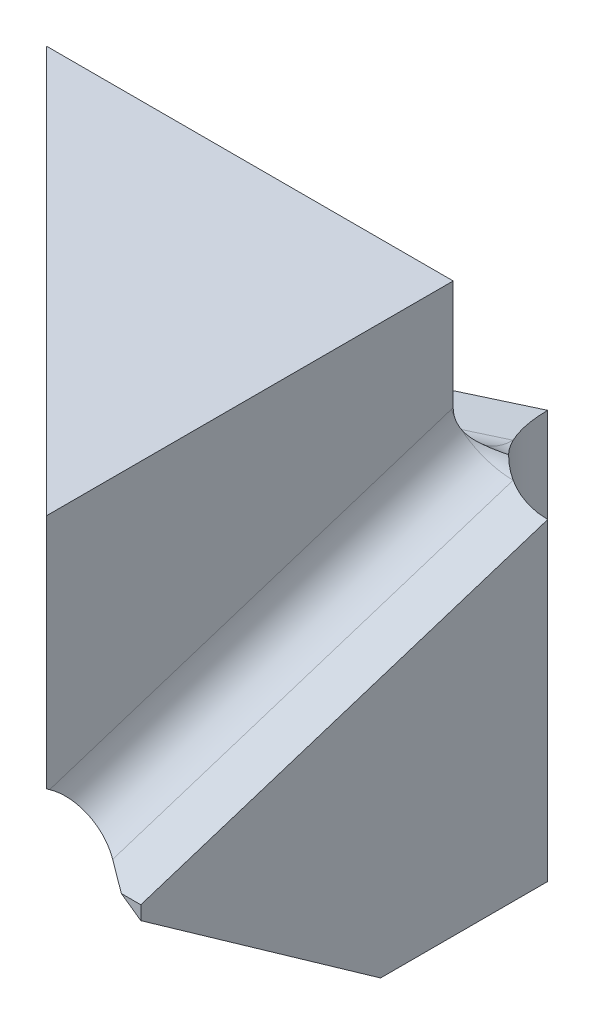
ISO-10303-21;
HEADER;
FILE_DESCRIPTION(('STEP AP214'),'2;1');
FILE_NAME('part.step','',(''),(''),'','','');
FILE_SCHEMA(('AUTOMOTIVE_DESIGN { 1 0 10303 214 1 1 1 1 }'));
ENDSEC;
DATA;
#1=APPLICATION_CONTEXT('core data for automotive mechanical design processes');
#2=APPLICATION_PROTOCOL_DEFINITION('international standard','automotive_design',2000,#1);
#3=PRODUCT_CONTEXT('',#1,'mechanical');
#4=PRODUCT('Part','Part','',(#3));
#5=PRODUCT_RELATED_PRODUCT_CATEGORY('part','',(#4));
#6=PRODUCT_DEFINITION_FORMATION('','',#4);
#7=PRODUCT_DEFINITION_CONTEXT('part definition',#1,'design');
#8=PRODUCT_DEFINITION('design','',#6,#7);
#9=PRODUCT_DEFINITION_SHAPE('','',#8);
#10=(LENGTH_UNIT() NAMED_UNIT(*) SI_UNIT(.MILLI.,.METRE.));
#11=(NAMED_UNIT(*) PLANE_ANGLE_UNIT() SI_UNIT($,.RADIAN.));
#12=(NAMED_UNIT(*) SI_UNIT($,.STERADIAN.) SOLID_ANGLE_UNIT());
#13=UNCERTAINTY_MEASURE_WITH_UNIT(LENGTH_MEASURE(1.E-05),#10,'distance_accuracy_value','');
#14=(GEOMETRIC_REPRESENTATION_CONTEXT(3) GLOBAL_UNCERTAINTY_ASSIGNED_CONTEXT((#13)) GLOBAL_UNIT_ASSIGNED_CONTEXT((#10,
#11,#12)) REPRESENTATION_CONTEXT('',''));
#15=CARTESIAN_POINT('',(0.,0.,0.));
#16=DIRECTION('',(0.,0.,1.));
#17=DIRECTION('',(1.,0.,0.));
#18=AXIS2_PLACEMENT_3D('',#15,#16,#17);
#19=CARTESIAN_POINT('',(-3.9587847280009,14.3567470669046,0.572733338777171));
#20=CARTESIAN_POINT('',(-4.,14.5390634799835,0.490840757525004));
#21=CARTESIAN_POINT('',(-4.,14.7252160576227,0.407225054296887));
#22=CARTESIAN_POINT('',(-3.94284944477179,14.3213982166722,0.683229532097432));
#23=CARTESIAN_POINT('',(-4.,14.5381938317096,0.586646422680381));
#24=CARTESIAN_POINT('',(-4.,14.7610316114819,0.486966757060718));
#25=CARTESIAN_POINT('',(-3.92228213629969,14.2864673353374,0.792419205635512));
#26=CARTESIAN_POINT('',(-4.,14.5366740066187,0.68208169559585));
#27=CARTESIAN_POINT('',(-4.,14.796520148253,0.566862144557146));
#28=CARTESIAN_POINT('',(-3.8727337027747,14.2178368997367,1.00694957451438));
#29=CARTESIAN_POINT('',(-4.,14.5317036798462,0.871853574955629));
#30=CARTESIAN_POINT('',(-4.,14.8664313247328,0.727144062725661));
#31=CARTESIAN_POINT('',(-3.84375016889392,14.1841377011069,1.11228915818009));
#32=CARTESIAN_POINT('',(-4.,14.5282347149522,0.966394602848275));
#33=CARTESIAN_POINT('',(-4.,14.9008536561546,0.807530727550029));
#34=CARTESIAN_POINT('',(-3.77805637034273,14.1182128690961,1.31836214031652));
#35=CARTESIAN_POINT('',(-4.,14.5186406293924,1.15440659142866));
#36=CARTESIAN_POINT('',(-4.,14.9683776412554,0.969360276642717));
#37=CARTESIAN_POINT('',(-3.74130605161888,14.0859959716296,1.41906823138416));
#38=CARTESIAN_POINT('',(-4.,14.5124684110823,1.24805165668356));
#39=CARTESIAN_POINT('',(-4.,15.0014713473771,1.05080649850616));
#40=CARTESIAN_POINT('',(-3.66134226974637,14.0235670379073,1.61421346196489));
#41=CARTESIAN_POINT('',(-4.,14.4968213692411,1.43321486030638));
#42=CARTESIAN_POINT('',(-4.,15.0656805276228,1.21447113533519));
#43=CARTESIAN_POINT('',(-3.61812933815874,13.9933548370566,1.70865311598176));
#44=CARTESIAN_POINT('',(-4.,14.4872955194984,1.52489007097519));
#45=CARTESIAN_POINT('',(-4.,15.0967961641468,1.29668948627105));
#46=CARTESIAN_POINT('',(-3.52510520879411,13.9342780126004,1.89332006194871));
#47=CARTESIAN_POINT('',(-4.,14.4639890996214,1.70836697505896));
#48=CARTESIAN_POINT('',(-4.,15.1575059033337,1.46463355037762));
#49=CARTESIAN_POINT('',(-3.47512875178548,13.9054860609305,1.9833201902945));
#50=CARTESIAN_POINT('',(-4.,14.4500126373161,1.8001713297107));
#51=CARTESIAN_POINT('',(-4.,15.1870209405877,1.55038803778439));
#52=CARTESIAN_POINT('',(-3.37124680385852,13.85050799515,2.15517491668371));
#53=CARTESIAN_POINT('',(-4.,14.4173962200826,1.97999170960518));
#54=CARTESIAN_POINT('',(-4.,15.2428498103331,1.72293100802866));
#55=CARTESIAN_POINT('',(-3.31734169821602,13.8243216261086,2.23703031161001));
#56=CARTESIAN_POINT('',(-4.,14.398660022636,2.06808664934039));
#57=CARTESIAN_POINT('',(-4.,15.2691639560568,1.80971938877758));
#58=CARTESIAN_POINT('',(-3.20726601880701,13.7746909172748,2.39216985255332));
#59=CARTESIAN_POINT('',(-4.,14.3561928720235,2.23935533800004));
#60=CARTESIAN_POINT('',(-4.,15.3179334849664,1.98419367495977));
#61=CARTESIAN_POINT('',(-3.15110023998523,13.7512411467669,2.46547097432481));
#62=CARTESIAN_POINT('',(-4.,14.332360285231,2.32256104049252));
#63=CARTESIAN_POINT('',(-4.,15.3403965535836,2.07187741389278));
#64=CARTESIAN_POINT('',(-3.03788042766943,13.7070195278565,2.6037023600683));
#65=CARTESIAN_POINT('',(-4.,14.2795145426535,2.48315219639589));
#66=CARTESIAN_POINT('',(-4.,15.380883935097,2.24825297812546));
#67=CARTESIAN_POINT('',(-2.98082660375943,13.6862470580211,2.668634566564));
#68=CARTESIAN_POINT('',(-4.,14.2503844128841,2.56049641252093));
#69=CARTESIAN_POINT('',(-4.,15.3989092789286,2.33694456427227));
#70=CARTESIAN_POINT('',(-2.86757279163667,13.6474346961127,2.78995727484036));
#71=CARTESIAN_POINT('',(-4.,14.1872794873121,2.70763752838669));
#72=CARTESIAN_POINT('',(-4.,15.4297433144023,2.51452387796022));
#73=CARTESIAN_POINT('',(-2.81136961682769,13.6293746211112,2.84641086599335));
#74=CARTESIAN_POINT('',(-4.,14.1532269926845,2.77739672363416));
#75=CARTESIAN_POINT('',(-4.,15.4425918711017,2.60340459230831));
#76=CARTESIAN_POINT('',(-2.70043004398257,13.5956370805876,2.95187030174123));
#77=CARTESIAN_POINT('',(-4.,14.0804727074215,2.90891644531297));
#78=CARTESIAN_POINT('',(-4.,15.4626176552203,2.78183207720505));
#79=CARTESIAN_POINT('',(-2.64569390750886,13.579960037646,3.00087482540135));
#80=CARTESIAN_POINT('',(-4.,14.0416720275391,2.97051576312377));
#81=CARTESIAN_POINT('',(-4.,15.4697938777163,2.87137896293887));
#82=CARTESIAN_POINT('',(-2.53919133773913,13.5509698431891,3.09149463651408));
#83=CARTESIAN_POINT('',(-4.,13.9606290246087,3.08387386658353));
#84=CARTESIAN_POINT('',(-4.,15.477771647049,3.04970102660568));
#85=CARTESIAN_POINT('',(-2.48739729521727,13.5376307563738,3.13319099455021));
#86=CARTESIAN_POINT('',(-4.,13.9183530606901,3.1355531970364));
#87=CARTESIAN_POINT('',(-4.,15.4786481142717,3.13847269002629));
#88=CARTESIAN_POINT('',(-2.38669442872466,13.5128782876611,3.21056419198254));
#89=CARTESIAN_POINT('',(-4.,13.8309728338749,3.2289944925258));
#90=CARTESIAN_POINT('',(-4.,15.4736220860094,3.31584260569087));
#91=CARTESIAN_POINT('',(-2.3377857255209,13.501464986331,3.246240779535));
#92=CARTESIAN_POINT('',(-4.,13.7858330402097,3.27052089669927));
#93=CARTESIAN_POINT('',(-4.,15.4677193069879,3.40444085052648));
#94=CARTESIAN_POINT('',(-2.24294701803069,13.4802726958408,3.31248529417998));
#95=CARTESIAN_POINT('',(-4.,13.693756163331,3.34311435610799));
#96=CARTESIAN_POINT('',(-4.,15.448514571647,3.58147300235636));
#97=CARTESIAN_POINT('',(-2.19704009508902,13.4705056247599,3.34301596681098));
#98=CARTESIAN_POINT('',(-4.,13.6468221686857,3.37384157580455));
#99=CARTESIAN_POINT('',(-4.,15.435161442217,3.66990148120799));
#100=CARTESIAN_POINT('',(-2.1088577643969,13.4524898519951,3.399331074577));
#101=CARTESIAN_POINT('',(-4.,13.5531797552249,3.42391410192285));
#102=CARTESIAN_POINT('',(-4.,15.4005461679276,3.84517465921719));
#103=CARTESIAN_POINT('',(-2.06658089153818,13.4442405361858,3.42511742939277));
#104=CARTESIAN_POINT('',(-4.,13.5065251942167,3.44299998186926));
#105=CARTESIAN_POINT('',(-4.,15.37928723254,3.93201998608967));
#106=CARTESIAN_POINT('',(-1.98489663581398,13.428887467458,3.47310924918496));
#107=CARTESIAN_POINT('',(-4.,13.4143895525466,3.46996967643741));
#108=CARTESIAN_POINT('',(-4.,15.327928014759,4.10512169171207));
#109=CARTESIAN_POINT('',(-1.94557056301251,13.4218121809257,3.49522573171049));
#110=CARTESIAN_POINT('',(-4.,13.3690833483177,3.47733316597455));
#111=CARTESIAN_POINT('',(-4.,15.2976473459936,4.19132519598123));
#112=CARTESIAN_POINT('',(-1.87075795898145,13.4088249269558,3.53582230319515));
#113=CARTESIAN_POINT('',(-4.,13.2828681584571,3.48056771974962));
#114=CARTESIAN_POINT('',(-4.,15.2281633045946,4.36023505535053));
#115=CARTESIAN_POINT('',(-1.83527876041303,13.4029151642024,3.55429550058021));
#116=CARTESIAN_POINT('',(-4.,13.2421240526581,3.47618410455557));
#117=CARTESIAN_POINT('',(-4.,15.1889433188087,4.44293455477388));
#118=CARTESIAN_POINT('',(-1.80176573367737,13.3974995936029,3.57122391358286));
#119=CARTESIAN_POINT('',(-4.,13.2052163299937,3.46648128327573));
#120=CARTESIAN_POINT('',(-4.,15.1451762287153,4.52323733509426));
#121=(BOUNDED_SURFACE() B_SPLINE_SURFACE(3,2,((#19,#20,#21),(#22,#23,#24),(#25,#26,#27),(#28,
#29,#30),(#31,#32,#33),(#34,#35,#36),(#37,#38,#39),(#40,#41,#42),(#43,#44,#45),(#46,#47,#48),
(#49,#50,#51),(#52,#53,#54),(#55,#56,#57),(#58,#59,#60),(#61,#62,#63),(#64,#65,#66),(#67,#68,
#69),(#70,#71,#72),(#73,#74,#75),(#76,#77,#78),(#79,#80,#81),(#82,#83,#84),(#85,#86,#87),(#88,
#89,#90),(#91,#92,#93),(#94,#95,#96),(#97,#98,#99),(#100,#101,#102),(#103,#104,#105),(#106,#107,
#108),(#109,#110,#111),(#112,#113,#114),(#115,#116,#117),(#118,#119,#120)),.UNSPECIFIED.,.F.,
.F.,.F.) B_SPLINE_SURFACE_WITH_KNOTS((4,2,2,2,2,2,2,2,2,2,2,2,2,2,2,2,4),(3,3),(0.,
0.262255722437478,0.524586579817895,0.788304839549322,1.05200141991811,1.3240243174193,
1.59602057390377,1.8674675354427,2.13885137704375,2.40810347455745,2.67740326268259,
2.94349499871625,3.20959786423251,3.47755137923927,3.74539623332907,4.01900395364131,
4.29312436348683),(0.,1.),
.UNSPECIFIED.) GEOMETRIC_REPRESENTATION_ITEM() RATIONAL_B_SPLINE_SURFACE(((1.,0.994834751101963,
1.),(1.,0.992831026008785,1.),(1.,0.990242198756409,1.),(1.,0.983968509338628,1.),(1.,
0.980283333377233,1.),(1.,0.97187016110895,1.),(1.,0.967136752663451,1.),(1.,0.956745821892291,
1.),(1.,0.95108837556681,1.),(1.,0.938783923009572,1.),(1.,0.932111311554105,1.),(1.,
0.918074565008446,1.),(1.,0.910710497707777,1.),(1.,0.895474392815812,1.),(1.,0.88760341110103,
1.),(1.,0.871512939183269,1.),(1.,0.863293530445041,1.),(1.,0.846735621862672,1.),(1.,
0.838398564647075,1.),(1.,0.821691743261551,1.),(1.,0.813321973560039,1.),(1.,0.796784430057094,
1.),(1.,0.788615437713728,1.),(1.,0.772488614543376,1.),(1.,0.764530792562669,1.),(1.,
0.748864851389619,1.),(1.,0.741158853686201,1.),(1.,0.726134208290024,1.),(1.,0.718815404785734,
1.),(1.,0.70446910192755,1.),(1.,0.697451258238533,1.),(1.,0.683911931378461,1.),(1.,
0.677391402934751,1.),(1.,0.671149337643525,1.))) REPRESENTATION_ITEM('') SURFACE());
#122=CARTESIAN_POINT('',(-0.407225054296884,14.7252160576226,4.));
#123=CARTESIAN_POINT('',(-0.490840804336252,14.5390634644715,4.));
#124=CARTESIAN_POINT('',(-0.572733430877928,14.3567470374406,3.95878471467631));
#125=CARTESIAN_POINT('',(-0.486966757070065,14.7610316114921,4.));
#126=CARTESIAN_POINT('',(-0.586646439602195,14.538193826124,4.));
#127=CARTESIAN_POINT('',(-0.683229565204288,14.321398206081,3.94284943997505));
#128=CARTESIAN_POINT('',(-0.56686214457917,14.7965201482654,4.));
#129=CARTESIAN_POINT('',(-0.682081700183671,14.5366740051162,4.));
#130=CARTESIAN_POINT('',(-0.792419214539417,14.286467332489,3.92228213500659));
#131=CARTESIAN_POINT('',(-0.727144062775511,14.8664313247477,4.));
#132=CARTESIAN_POINT('',(-0.871853570395886,14.5317036813537,4.));
#133=CARTESIAN_POINT('',(-1.00694956571245,14.2178369025525,3.87273370404404));
#134=CARTESIAN_POINT('',(-0.807530727615038,14.9008536561698,4.));
#135=CARTESIAN_POINT('',(-0.966394601677082,14.5282347153531,4.));
#136=CARTESIAN_POINT('',(-1.11228915588401,14.1841377018414,3.84375016922061));
#137=CARTESIAN_POINT('',(-0.969360276736809,14.9683776412835,4.));
#138=CARTESIAN_POINT('',(-1.15440659282498,14.5186406289589,4.));
#139=CARTESIAN_POINT('',(-1.31836214285246,14.1182128682848,3.77805636994171));
#140=CARTESIAN_POINT('',(-1.05080649861418,15.0014713474178,4.));
#141=CARTESIAN_POINT('',(-1.24805165717336,14.5124684109407,4.));
#142=CARTESIAN_POINT('',(-1.41906823220261,14.0859959713678,3.74130605143864));
#143=CARTESIAN_POINT('',(-1.21447113547482,15.0656805276793,4.));
#144=CARTESIAN_POINT('',(-1.43321486009169,14.49682136936,4.));
#145=CARTESIAN_POINT('',(-1.61421346144477,14.0235670380737,3.66134226980438));
#146=CARTESIAN_POINT('',(-1.29668948642835,15.0967961642063,4.));
#147=CARTESIAN_POINT('',(-1.52489007097835,14.4872955195826,4.));
#148=CARTESIAN_POINT('',(-1.70865311584038,13.9933548371018,3.61812933823422));
#149=CARTESIAN_POINT('',(-1.46463355053873,15.1575059033891,4.));
#150=CARTESIAN_POINT('',(-1.70836697541343,14.4639890994888,4.));
#151=CARTESIAN_POINT('',(-1.89332006244599,13.9342780124414,3.5251052085392));
#152=CARTESIAN_POINT('',(-1.55038803793125,15.1870209406368,4.));
#153=CARTESIAN_POINT('',(-1.80017133020941,14.4500126369944,4.));
#154=CARTESIAN_POINT('',(-1.98332019105145,13.9054860606884,3.47512875117263));
#155=CARTESIAN_POINT('',(-1.72293100814693,15.2428498103698,4.));
#156=CARTESIAN_POINT('',(-1.97999170936587,14.4173962203595,4.));
#157=CARTESIAN_POINT('',(-2.15517491619675,13.8505079953058,3.37124680430815));
#158=CARTESIAN_POINT('',(-1.8097193888815,15.2691639560873,4.));
#159=CARTESIAN_POINT('',(-2.06808664815174,14.3986600237262,4.));
#160=CARTESIAN_POINT('',(-2.23703030961963,13.8243216267453,3.31734170008592));
#161=CARTESIAN_POINT('',(-1.98419367503462,15.3179334849859,4.));
#162=CARTESIAN_POINT('',(-2.23935533942236,14.3561928708684,4.));
#163=CARTESIAN_POINT('',(-2.39216985467702,13.7746909165954,3.20726601684344));
#164=CARTESIAN_POINT('',(-2.0718774139529,15.3403965535982,4.));
#165=CARTESIAN_POINT('',(-2.32256104572954,14.3323602809078,4.));
#166=CARTESIAN_POINT('',(-2.46547098205161,13.751241144295,3.15110023278141));
#167=CARTESIAN_POINT('',(-2.24825297815577,15.3808839351032,4.));
#168=CARTESIAN_POINT('',(-2.48315219095676,14.2795145470894,4.));
#169=CARTESIAN_POINT('',(-2.60370235241894,13.7070195303036,3.03788043480962));
#170=CARTESIAN_POINT('',(-2.33694456428751,15.3989092789312,4.));
#171=CARTESIAN_POINT('',(-2.56049639158915,14.2503844297637,4.));
#172=CARTESIAN_POINT('',(-2.66863453794155,13.6862470671777,2.9808266304781));
#173=CARTESIAN_POINT('',(-2.51452387795965,15.4297433144023,4.));
#174=CARTESIAN_POINT('',(-2.70763750650069,14.1872795047018,4.));
#175=CARTESIAN_POINT('',(-2.78995724639888,13.6474347052114,2.86757281818723));
#176=CARTESIAN_POINT('',(-2.60340459230715,15.4425918711018,4.));
#177=CARTESIAN_POINT('',(-2.77739671762668,14.153226997431,4.));
#178=CARTESIAN_POINT('',(-2.8464108583751,13.6293746235483,2.81136962393933));
#179=CARTESIAN_POINT('',(-2.78183207720282,15.4626176552197,4.));
#180=CARTESIAN_POINT('',(-2.90891645160853,14.080472702486,4.));
#181=CARTESIAN_POINT('',(-2.95187030936,13.5956370781503,2.70043003687055));
#182=CARTESIAN_POINT('',(-2.87137896293615,15.4697938777148,4.));
#183=CARTESIAN_POINT('',(-2.97051576483739,14.0416720261984,4.));
#184=CARTESIAN_POINT('',(-3.00087482742925,13.5799600369972,2.64569390561647));
#185=CARTESIAN_POINT('',(-3.04970102660299,15.4777716470477,4.));
#186=CARTESIAN_POINT('',(-3.08387386481225,13.96062902599,4.));
#187=CARTESIAN_POINT('',(-3.09149463450686,13.5509698438312,2.53919133961307));
#188=CARTESIAN_POINT('',(-3.13847269002414,15.4786481142714,4.));
#189=CARTESIAN_POINT('',(-3.13555319655319,13.9183530610657,4.));
#190=CARTESIAN_POINT('',(-3.13319099401434,13.5376307565452,2.48739729571666));
#191=CARTESIAN_POINT('',(-3.31584260568979,15.4736220860098,4.));
#192=CARTESIAN_POINT('',(-3.22899449302988,13.8309728334797,4.));
#193=CARTESIAN_POINT('',(-3.21056419252153,13.5128782874887,2.38669442822123));
#194=CARTESIAN_POINT('',(-3.40444085052595,15.467719306988,4.));
#195=CARTESIAN_POINT('',(-3.27052089683558,13.7858330401046,4.));
#196=CARTESIAN_POINT('',(-3.24624077967742,13.5014649862854,2.33778572538928));
#197=CARTESIAN_POINT('',(-3.58147300235635,15.4485145716469,4.));
#198=CARTESIAN_POINT('',(-3.34311435596308,13.6937561634464,4.));
#199=CARTESIAN_POINT('',(-3.31248529403292,13.4802726958879,2.24294701816847));
#200=CARTESIAN_POINT('',(-3.66990148120796,15.435161442217,4.));
#201=CARTESIAN_POINT('',(-3.37384157576686,13.6468221687123,4.));
#202=CARTESIAN_POINT('',(-3.34301596677456,13.4705056247716,2.19704009512106));
#203=CARTESIAN_POINT('',(-3.84517465921717,15.4005461679276,4.));
#204=CARTESIAN_POINT('',(-3.42391410196554,13.5531797551877,4.));
#205=CARTESIAN_POINT('',(-3.39933107461914,13.4524898519816,2.10885776435591));
#206=CARTESIAN_POINT('',(-3.93201998608965,15.37928723254,4.));
#207=CARTESIAN_POINT('',(-3.44299998188072,13.5065251942096,4.));
#208=CARTESIAN_POINT('',(-3.42511742940288,13.4442405361826,2.06658089152984));
#209=CARTESIAN_POINT('',(-4.10512169171209,15.3279280147589,4.));
#210=CARTESIAN_POINT('',(-3.46996967642292,13.4143895525634,4.));
#211=CARTESIAN_POINT('',(-3.47310924916989,13.4288874674628,1.98489663583057));
#212=CARTESIAN_POINT('',(-4.19132519598127,15.2976473459936,4.));
#213=CARTESIAN_POINT('',(-3.47733316596727,13.3690833483259,4.));
#214=CARTESIAN_POINT('',(-3.49522573170313,13.4218121809281,1.9455705630205));
#215=CARTESIAN_POINT('',(-4.36023505535058,15.2281633045946,4.));
#216=CARTESIAN_POINT('',(-3.48056771975693,13.2828681584495,4.));
#217=CARTESIAN_POINT('',(-3.5358223032021,13.4088249269536,1.87075795897424));
#218=CARTESIAN_POINT('',(-4.44293455477389,15.1889433188087,4.));
#219=CARTESIAN_POINT('',(-3.47618410457022,13.2421240526434,4.));
#220=CARTESIAN_POINT('',(-3.55429550059377,13.4029151641981,1.83527876039921));
#221=CARTESIAN_POINT('',(-4.52323733509426,15.1451762287153,4.));
#222=CARTESIAN_POINT('',(-3.46648128327581,13.2052163299974,4.));
#223=CARTESIAN_POINT('',(-3.5712239135814,13.3974995936034,1.80176573368026));
#224=(BOUNDED_SURFACE() B_SPLINE_SURFACE(3,2,((#122,#123,#124),(#125,#126,#127),(#128,#129,
#130),(#131,#132,#133),(#134,#135,#136),(#137,#138,#139),(#140,#141,#142),(#143,#144,#145),
(#146,#147,#148),(#149,#150,#151),(#152,#153,#154),(#155,#156,#157),(#158,#159,#160),(#161,#162,
#163),(#164,#165,#166),(#167,#168,#169),(#170,#171,#172),(#173,#174,#175),(#176,#177,#178),
(#179,#180,#181),(#182,#183,#184),(#185,#186,#187),(#188,#189,#190),(#191,#192,#193),(#194,#195,
#196),(#197,#198,#199),(#200,#201,#202),(#203,#204,#205),(#206,#207,#208),(#209,#210,#211),
(#212,#213,#214),(#215,#216,#217),(#218,#219,#220),(#221,#222,#223)),.UNSPECIFIED.,.F.,.F.,
.F.) B_SPLINE_SURFACE_WITH_KNOTS((4,2,2,2,2,2,2,2,2,2,2,2,2,2,2,2,4),(3,3),(0.,
0.262255722475094,0.524586579897764,0.788304839682137,1.05200142010368,1.32402431755843,
1.59602057399633,1.86746753548888,2.13885137704356,2.40810347455554,2.67740326267904,
2.94349499871437,3.20959786423222,3.47755137923895,3.74539623332879,4.0190039536411,
4.29312436348654),(0.,1.),
.UNSPECIFIED.) GEOMETRIC_REPRESENTATION_ITEM() RATIONAL_B_SPLINE_SURFACE(((1.,0.994834749427741,
1.),(1.,0.992831025405585,1.),(1.,0.990242198593689,1.),(1.,0.98396850949848,1.),(1.,
0.980283333418999,1.),(1.,0.971870161058714,1.),(1.,0.967136752640024,1.),(1.,0.956745821899834,
1.),(1.,0.951088375578517,1.),(1.,0.938783922974079,1.),(1.,0.932111311465733,1.),(1.,
0.918074565074762,1.),(1.,0.910710497981635,1.),(1.,0.895474392529018,1.),(1.,0.887603410048012,
1.),(1.,0.871512940227235,1.),(1.,0.863293534351372,1.),(1.,0.846735625744405,1.),(1.,
0.838398565686788,1.),(1.,0.821691742221786,1.),(1.,0.813321973283455,1.),(1.,0.796784430331125,
1.),(1.,0.788615437786708,1.),(1.,0.772488614469751,1.),(1.,0.764530792543498,1.),(1.,
0.748864851409788,1.),(1.,0.741158853690763,1.),(1.,0.726134208283934,1.),(1.,0.718815404784589,
1.),(1.,0.704469101930136,1.),(1.,0.697451258239771,1.),(1.,0.683911931377363,1.),(1.,
0.677391402932665,1.),(1.,0.671149337644063,1.))) REPRESENTATION_ITEM('') SURFACE());
#225=CARTESIAN_POINT('',(-2.82842712474617,13.6351278018938,2.82842712474621));
#226=CARTESIAN_POINT('',(-2.85167648607855,13.6490581916893,2.85167648608108));
#227=CARTESIAN_POINT('',(-2.87488011554882,13.6631406272126,2.87488011555034));
#228=CARTESIAN_POINT('',(-2.92118819519962,13.6916298931501,2.92118819519754));
#229=CARTESIAN_POINT('',(-2.94429264307817,13.7060367310457,2.94429264307348));
#230=CARTESIAN_POINT('',(-3.01349837560542,13.7498077005406,3.01349837559856));
#231=CARTESIAN_POINT('',(-3.05943719726923,13.7796895408378,3.05943719726847));
#232=CARTESIAN_POINT('',(-3.15192603758755,13.8420303431432,3.15192603759077));
#233=CARTESIAN_POINT('',(-3.19846024512489,13.8745364756343,3.19846024512576));
#234=CARTESIAN_POINT('',(-3.29055079775429,13.9421933317195,3.29055079775365));
#235=CARTESIAN_POINT('',(-3.33610752611239,13.9773429935067,3.33610752611258));
#236=CARTESIAN_POINT('',(-3.41351347350323,14.0414635338406,3.41351347350311));
#237=CARTESIAN_POINT('',(-3.44573409533997,14.0695302491174,3.44573409533919));
#238=CARTESIAN_POINT('',(-3.50897156797626,14.1282934157641,3.50897156797546));
#239=CARTESIAN_POINT('',(-3.53998828848459,14.1589901506191,3.53998828848442));
#240=CARTESIAN_POINT('',(-3.60009005321519,14.2233089626417,3.60009005321536));
#241=CARTESIAN_POINT('',(-3.62918881402903,14.2569050784541,3.6291888140289));
#242=CARTESIAN_POINT('',(-3.68514389977731,14.3276205481923,3.68514389977707));
#243=CARTESIAN_POINT('',(-3.71200138422714,14.3647380588316,3.71200138422708));
#244=CARTESIAN_POINT('',(-3.77480639758439,14.4610020638988,3.77480639758449));
#245=CARTESIAN_POINT('',(-3.80912684624783,14.5223294575896,3.80912684624779));
#246=CARTESIAN_POINT('',(-3.86994326840339,14.652448285142,3.86994326840344));
#247=CARTESIAN_POINT('',(-3.89643047337706,14.7212479666119,3.89643047337733));
#248=CARTESIAN_POINT('',(-3.94055221491721,14.8643803778788,3.94055221491693));
#249=CARTESIAN_POINT('',(-3.95817779103729,14.9387186211671,3.95817779103623));
#250=CARTESIAN_POINT('',(-3.98431448271526,15.0904561785025,3.98431448271419));
#251=CARTESIAN_POINT('',(-3.99283168800668,15.1678534114057,3.99283168800636));
#252=CARTESIAN_POINT('',(-3.9990138861271,15.283403775588,3.99901388612725));
#253=CARTESIAN_POINT('',(-4.00000845823348,15.3212464399276,4.00000845823367));
#254=CARTESIAN_POINT('',(-4.,15.3590536027083,4.));
#255=B_SPLINE_CURVE_WITH_KNOTS('',3,(#225,#226,#227,#228,#229,#230,#231,#232,#233,#234,#235,
#236,#237,#238,#239,#240,#241,#242,#243,#244,#245,#246,#247,#248,#249,#250,#251,#252,#253,#254),
.UNSPECIFIED.,.F.,.F.,(4,2,2,2,2,2,2,2,2,2,2,2,2,2,4),(0.,0.10712554269761,0.214253558451141,
0.42876214902061,0.648925387189087,0.869000661514907,1.02948365472535,1.18998396792311,
1.34917241585437,1.50827799101802,1.74183295187253,1.97564837263952,2.20969974303848,
2.44359453183673,2.55707108828548),.UNSPECIFIED.);
#256=CARTESIAN_POINT('',(-3.8225482657084,14.5522296004732,3.82254826570788));
#257=VERTEX_POINT('',#256);
#258=CARTESIAN_POINT('',(-2.82842712474617,13.6351278018938,2.82842712474621));
#259=VERTEX_POINT('',#258);
#260=EDGE_CURVE('E348',#257,#259,#255,.F.);
#261=ORIENTED_EDGE('',*,*,#260,.F.);
#262=CARTESIAN_POINT('',(-2.,15.3366670887182,4.07349775505904));
#263=DIRECTION('',(0.,-0.30469806996064,0.952448993995091));
#264=DIRECTION('',(0.,-0.952448993995091,-0.30469806996064));
#265=AXIS2_PLACEMENT_3D('',#262,#263,#264);
#266=CIRCLE('',#265,2.);
#267=CARTESIAN_POINT('',(-2.,13.431769100728,3.46410161513776));
#268=VERTEX_POINT('',#267);
#269=EDGE_CURVE('E385',#257,#268,#266,.T.);
#270=ORIENTED_EDGE('',*,*,#269,.T.);
#271=CARTESIAN_POINT('',(0.,14.5399702568368,0.));
#272=DIRECTION('',(0.,-0.952448993995091,-0.30469806996064));
#273=DIRECTION('',(0.,-0.30469806996064,0.952448993995091));
#274=AXIS2_PLACEMENT_3D('',#271,#272,#273);
#275=ELLIPSE('',#274,4.19969995791776,4.);
#276=EDGE_CURVE('E422',#259,#268,#275,.F.);
#277=ORIENTED_EDGE('',*,*,#276,.F.);
#278=EDGE_LOOP('',(#261,#270,#277));
#279=FACE_BOUND('',#278,.T.);
#280=ADVANCED_FACE('F96',(#279),#121,.F.);
#281=CARTESIAN_POINT('',(-4.07349775505903,15.3366670887182,2.));
#282=DIRECTION('',(-0.952448993995091,-0.30469806996064,0.));
#283=DIRECTION('',(0.30469806996064,-0.952448993995091,0.));
#284=AXIS2_PLACEMENT_3D('',#281,#282,#283);
#285=CIRCLE('',#284,2.);
#286=CARTESIAN_POINT('',(-3.46410161513775,13.431769100728,2.));
#287=VERTEX_POINT('',#286);
#288=EDGE_CURVE('E344',#287,#257,#285,.T.);
#289=ORIENTED_EDGE('',*,*,#288,.T.);
#290=ORIENTED_EDGE('',*,*,#260,.T.);
#291=CARTESIAN_POINT('',(0.,14.5399702568368,0.));
#292=DIRECTION('',(0.30469806996064,-0.952448993995091,0.));
#293=DIRECTION('',(-0.952448993995091,-0.30469806996064,0.));
#294=AXIS2_PLACEMENT_3D('',#291,#292,#293);
#295=ELLIPSE('',#294,4.19969995791776,4.);
#296=EDGE_CURVE('E371',#287,#259,#295,.F.);
#297=ORIENTED_EDGE('',*,*,#296,.F.);
#298=EDGE_LOOP('',(#289,#290,#297));
#299=FACE_BOUND('',#298,.T.);
#300=ADVANCED_FACE('F281',(#299),#224,.F.);
#301=CARTESIAN_POINT('',(0.,20.,0.));
#302=DIRECTION('',(0.,1.,0.));
#303=DIRECTION('',(0.,0.,1.));
#304=AXIS2_PLACEMENT_3D('',#301,#302,#303);
#305=PLANE('',#304);
#306=DIRECTION('',(0.,0.,1.));
#307=VECTOR('',#306,1.);
#308=CARTESIAN_POINT('',(-4.,20.,21.2132034355964));
#309=LINE('',#308,#307);
#310=CARTESIAN_POINT('',(-4.,20.,4.));
#311=VERTEX_POINT('',#310);
#312=CARTESIAN_POINT('',(-4.,20.,21.2132034355964));
#313=VERTEX_POINT('',#312);
#314=EDGE_CURVE('E200',#311,#313,#309,.T.);
#315=ORIENTED_EDGE('',*,*,#314,.F.);
#316=DIRECTION('',(1.,0.,0.));
#317=VECTOR('',#316,1.);
#318=CARTESIAN_POINT('',(-21.2132034355964,20.,4.));
#319=LINE('',#318,#317);
#320=CARTESIAN_POINT('',(-21.2132034355964,20.,4.));
#321=VERTEX_POINT('',#320);
#322=EDGE_CURVE('E216',#321,#311,#319,.T.);
#323=ORIENTED_EDGE('',*,*,#322,.F.);
#324=DIRECTION('',(0.707106781186547,0.,0.707106781186548));
#325=VECTOR('',#324,1.);
#326=CARTESIAN_POINT('',(-4.,20.,21.2132034355964));
#327=LINE('',#326,#325);
#328=EDGE_CURVE('E214',#321,#313,#327,.T.);
#329=ORIENTED_EDGE('',*,*,#328,.T.);
#330=EDGE_LOOP('',(#315,#323,#329));
#331=FACE_BOUND('',#330,.T.);
#332=ADVANCED_FACE('F215',(#331),#305,.T.);
#333=CARTESIAN_POINT('',(0.,20.,21.2132034355964));
#334=DIRECTION('',(0.,0.,-1.));
#335=DIRECTION('',(-1.,0.,0.));
#336=AXIS2_PLACEMENT_3D('',#333,#334,#335);
#337=PLANE('',#336);
#338=DIRECTION('',(1.,0.,0.));
#339=VECTOR('',#338,1.);
#340=CARTESIAN_POINT('',(-4.,7.75365184476445,21.2132034355964));
#341=LINE('',#340,#339);
#342=CARTESIAN_POINT('',(-0.823183973054102,7.75365184476445,21.2132034355964));
#343=VERTEX_POINT('',#342);
#344=CARTESIAN_POINT('',(0.,7.75365184476445,21.2132034355964));
#345=VERTEX_POINT('',#344);
#346=EDGE_CURVE('E210',#343,#345,#341,.T.);
#347=ORIENTED_EDGE('',*,*,#346,.F.);
#348=DIRECTION('',(-0.816496580927727,0.577350269189624,0.));
#349=VECTOR('',#348,1.);
#350=CARTESIAN_POINT('',(-4.,9.99999999999999,21.2132034355964));
#351=LINE('',#350,#349);
#352=CARTESIAN_POINT('',(0.,7.17157287525381,21.2132034355964));
#353=VERTEX_POINT('',#352);
#354=EDGE_CURVE('E398',#343,#353,#351,.F.);
#355=ORIENTED_EDGE('',*,*,#354,.T.);
#356=DIRECTION('',(0.,-1.,0.));
#357=VECTOR('',#356,1.);
#358=CARTESIAN_POINT('',(0.,20.,21.2132034355964));
#359=LINE('',#358,#357);
#360=EDGE_CURVE('E239',#345,#353,#359,.T.);
#361=ORIENTED_EDGE('',*,*,#360,.F.);
#362=EDGE_LOOP('',(#347,#355,#361));
#363=FACE_BOUND('',#362,.T.);
#364=ADVANCED_FACE('F436',(#363),#337,.F.);
#365=CARTESIAN_POINT('',(0.,20.,4.));
#366=DIRECTION('',(-1.,0.,0.));
#367=DIRECTION('',(0.,0.,1.));
#368=AXIS2_PLACEMENT_3D('',#365,#366,#367);
#369=PLANE('',#368);
#370=ORIENTED_EDGE('',*,*,#360,.T.);
#371=DIRECTION('',(0.,0.577350269189624,0.816496580927727));
#372=VECTOR('',#371,1.);
#373=CARTESIAN_POINT('',(0.,8.11438191683587,22.5465367689298));
#374=LINE('',#373,#372);
#375=CARTESIAN_POINT('',(0.,0.,11.0710678118654));
#376=VERTEX_POINT('',#375);
#377=EDGE_CURVE('E400',#353,#376,#374,.F.);
#378=ORIENTED_EDGE('',*,*,#377,.T.);
#379=DIRECTION('',(0.,0.,-1.));
#380=VECTOR('',#379,1.);
#381=CARTESIAN_POINT('',(0.,0.,4.));
#382=LINE('',#381,#380);
#383=CARTESIAN_POINT('',(0.,0.,4.));
#384=VERTEX_POINT('',#383);
#385=EDGE_CURVE('E374',#376,#384,#382,.T.);
#386=ORIENTED_EDGE('',*,*,#385,.T.);
#387=DIRECTION('',(0.,-1.,0.));
#388=VECTOR('',#387,1.);
#389=CARTESIAN_POINT('',(0.,20.,4.));
#390=LINE('',#389,#388);
#391=CARTESIAN_POINT('',(0.,13.2603297852455,4.));
#392=VERTEX_POINT('',#391);
#393=EDGE_CURVE('E236',#392,#384,#390,.T.);
#394=ORIENTED_EDGE('',*,*,#393,.F.);
#395=DIRECTION('',(0.,0.30469806996064,-0.952448993995091));
#396=VECTOR('',#395,1.);
#397=CARTESIAN_POINT('',(0.,14.5399702568368,0.));
#398=LINE('',#397,#396);
#399=EDGE_CURVE('E211',#345,#392,#398,.T.);
#400=ORIENTED_EDGE('',*,*,#399,.F.);
#401=EDGE_LOOP('',(#370,#378,#386,#394,#400));
#402=FACE_BOUND('',#401,.T.);
#403=ADVANCED_FACE('F452',(#402),#369,.F.);
#404=CARTESIAN_POINT('',(0.,20.,0.));
#405=DIRECTION('',(0.,-1.,0.));
#406=DIRECTION('',(0.,0.,-1.));
#407=AXIS2_PLACEMENT_3D('',#404,#405,#406);
#408=CYLINDRICAL_SURFACE('',#407,4.);
#409=CARTESIAN_POINT('',(-4.,13.2603297852454,0.));
#410=VERTEX_POINT('',#409);
#411=EDGE_CURVE('E362',#410,#287,#295,.F.);
#412=ORIENTED_EDGE('',*,*,#411,.T.);
#413=ORIENTED_EDGE('',*,*,#296,.T.);
#414=ORIENTED_EDGE('',*,*,#276,.T.);
#415=EDGE_CURVE('E425',#268,#392,#275,.F.);
#416=ORIENTED_EDGE('',*,*,#415,.T.);
#417=ORIENTED_EDGE('',*,*,#393,.T.);
#418=CARTESIAN_POINT('',(0.,0.,0.));
#419=DIRECTION('',(0.,-1.,0.));
#420=DIRECTION('',(0.,0.,1.));
#421=AXIS2_PLACEMENT_3D('',#418,#419,#420);
#422=CIRCLE('',#421,4.);
#423=CARTESIAN_POINT('',(-4.,0.,0.));
#424=VERTEX_POINT('',#423);
#425=EDGE_CURVE('E441',#384,#424,#422,.T.);
#426=ORIENTED_EDGE('',*,*,#425,.T.);
#427=DIRECTION('',(0.,-1.,0.));
#428=VECTOR('',#427,1.);
#429=CARTESIAN_POINT('',(-4.,20.,0.));
#430=LINE('',#429,#428);
#431=EDGE_CURVE('E234',#410,#424,#430,.T.);
#432=ORIENTED_EDGE('',*,*,#431,.F.);
#433=EDGE_LOOP('',(#412,#413,#414,#416,#417,#426,#432));
#434=FACE_BOUND('',#433,.T.);
#435=ADVANCED_FACE('F369',(#434),#408,.F.);
#436=CARTESIAN_POINT('',(-21.2132034355964,20.,0.));
#437=DIRECTION('',(0.,0.,1.));
#438=DIRECTION('',(1.,0.,0.));
#439=AXIS2_PLACEMENT_3D('',#436,#437,#438);
#440=PLANE('',#439);
#441=DIRECTION('',(-1.,0.,0.));
#442=VECTOR('',#441,1.);
#443=CARTESIAN_POINT('',(-21.2132034355964,0.,0.));
#444=LINE('',#443,#442);
#445=CARTESIAN_POINT('',(-11.0710678118654,0.,0.));
#446=VERTEX_POINT('',#445);
#447=EDGE_CURVE('E219',#424,#446,#444,.T.);
#448=ORIENTED_EDGE('',*,*,#447,.T.);
#449=DIRECTION('',(0.816496580927727,-0.577350269189624,0.));
#450=VECTOR('',#449,1.);
#451=CARTESIAN_POINT('',(-11.0710678118654,0.,0.));
#452=LINE('',#451,#450);
#453=CARTESIAN_POINT('',(-21.2132034355964,7.17157287525382,0.));
#454=VERTEX_POINT('',#453);
#455=EDGE_CURVE('E404',#446,#454,#452,.F.);
#456=ORIENTED_EDGE('',*,*,#455,.T.);
#457=DIRECTION('',(0.,-1.,0.));
#458=VECTOR('',#457,1.);
#459=CARTESIAN_POINT('',(-21.2132034355964,20.,0.));
#460=LINE('',#459,#458);
#461=CARTESIAN_POINT('',(-21.2132034355964,7.75365184476445,0.));
#462=VERTEX_POINT('',#461);
#463=EDGE_CURVE('E227',#462,#454,#460,.T.);
#464=ORIENTED_EDGE('',*,*,#463,.F.);
#465=DIRECTION('',(-0.952448993995091,-0.30469806996064,0.));
#466=VECTOR('',#465,1.);
#467=CARTESIAN_POINT('',(-21.2132034355964,7.75365184476445,0.));
#468=LINE('',#467,#466);
#469=EDGE_CURVE('E414',#410,#462,#468,.T.);
#470=ORIENTED_EDGE('',*,*,#469,.F.);
#471=ORIENTED_EDGE('',*,*,#431,.T.);
#472=EDGE_LOOP('',(#448,#456,#464,#470,#471));
#473=FACE_BOUND('',#472,.T.);
#474=ADVANCED_FACE('F446',(#473),#440,.F.);
#475=CARTESIAN_POINT('',(-21.2132034355964,20.,4.));
#476=DIRECTION('',(1.,0.,0.));
#477=DIRECTION('',(0.,0.,-1.));
#478=AXIS2_PLACEMENT_3D('',#475,#476,#477);
#479=PLANE('',#478);
#480=ORIENTED_EDGE('',*,*,#463,.T.);
#481=DIRECTION('',(0.,-0.577350269189624,-0.816496580927727));
#482=VECTOR('',#481,1.);
#483=CARTESIAN_POINT('',(-21.2132034355964,18.1143819168359,15.4754689570643));
#484=LINE('',#483,#482);
#485=CARTESIAN_POINT('',(-21.2132034355964,7.75365184476445,0.823183973054097));
#486=VERTEX_POINT('',#485);
#487=EDGE_CURVE('E406',#454,#486,#484,.F.);
#488=ORIENTED_EDGE('',*,*,#487,.T.);
#489=DIRECTION('',(0.,0.,-1.));
#490=VECTOR('',#489,1.);
#491=CARTESIAN_POINT('',(-21.2132034355964,7.75365184476445,4.));
#492=LINE('',#491,#490);
#493=EDGE_CURVE('E376',#486,#462,#492,.T.);
#494=ORIENTED_EDGE('',*,*,#493,.T.);
#495=EDGE_LOOP('',(#480,#488,#494));
#496=FACE_BOUND('',#495,.T.);
#497=ADVANCED_FACE('F410',(#496),#479,.F.);
#498=CARTESIAN_POINT('',(-4.,20.,21.2132034355964));
#499=DIRECTION('',(0.707106781186548,0.,-0.707106781186547));
#500=DIRECTION('',(-0.707106781186547,0.,-0.707106781186548));
#501=AXIS2_PLACEMENT_3D('',#498,#499,#500);
#502=PLANE('',#501);
#503=DIRECTION('',(0.,-1.,0.));
#504=VECTOR('',#503,1.);
#505=CARTESIAN_POINT('',(-21.2132034355964,20.,4.));
#506=LINE('',#505,#504);
#507=CARTESIAN_POINT('',(-21.2132034355964,9.99999999999999,4.));
#508=VERTEX_POINT('',#507);
#509=EDGE_CURVE('E225',#321,#508,#506,.T.);
#510=ORIENTED_EDGE('',*,*,#509,.T.);
#511=DIRECTION('',(0.707106781186547,0.,0.707106781186548));
#512=VECTOR('',#511,1.);
#513=CARTESIAN_POINT('',(-4.,9.99999999999999,21.2132034355964));
#514=LINE('',#513,#512);
#515=CARTESIAN_POINT('',(-4.,9.99999999999999,21.2132034355964));
#516=VERTEX_POINT('',#515);
#517=EDGE_CURVE('E224',#508,#516,#514,.T.);
#518=ORIENTED_EDGE('',*,*,#517,.T.);
#519=DIRECTION('',(0.,-1.,0.));
#520=VECTOR('',#519,1.);
#521=CARTESIAN_POINT('',(-4.,20.,21.2132034355964));
#522=LINE('',#521,#520);
#523=EDGE_CURVE('E204',#313,#516,#522,.T.);
#524=ORIENTED_EDGE('',*,*,#523,.F.);
#525=ORIENTED_EDGE('',*,*,#328,.F.);
#526=EDGE_LOOP('',(#510,#518,#524,#525));
#527=FACE_BOUND('',#526,.T.);
#528=ADVANCED_FACE('F222',(#527),#502,.F.);
#529=CARTESIAN_POINT('',(0.,0.,0.));
#530=DIRECTION('',(0.,1.,0.));
#531=DIRECTION('',(0.,0.,1.));
#532=AXIS2_PLACEMENT_3D('',#529,#530,#531);
#533=PLANE('',#532);
#534=ORIENTED_EDGE('',*,*,#385,.F.);
#535=DIRECTION('',(-0.707106781186547,0.,-0.707106781186548));
#536=VECTOR('',#535,1.);
#537=CARTESIAN_POINT('',(-5.53553390593271,0.,5.53553390593271));
#538=LINE('',#537,#536);
#539=EDGE_CURVE('E402',#376,#446,#538,.T.);
#540=ORIENTED_EDGE('',*,*,#539,.T.);
#541=ORIENTED_EDGE('',*,*,#447,.F.);
#542=ORIENTED_EDGE('',*,*,#425,.F.);
#543=EDGE_LOOP('',(#534,#540,#541,#542));
#544=FACE_BOUND('',#543,.T.);
#545=ADVANCED_FACE('F450',(#544),#533,.F.);
#546=CARTESIAN_POINT('',(-21.2132034355964,7.75365184476445,4.));
#547=DIRECTION('',(0.30469806996064,-0.952448993995091,0.));
#548=DIRECTION('',(0.952448993995091,0.30469806996064,0.));
#549=AXIS2_PLACEMENT_3D('',#546,#547,#548);
#550=PLANE('',#549);
#551=ORIENTED_EDGE('',*,*,#493,.F.);
#552=DIRECTION('',(-0.557983076275752,-0.17850443171637,-0.810426464552746));
#553=VECTOR('',#552,1.);
#554=CARTESIAN_POINT('',(-6.40976138065131,12.4894227378556,22.3240174533006));
#555=LINE('',#554,#553);
#556=CARTESIAN_POINT('',(-20.4029591313359,8.01285719566649,2.));
#557=VERTEX_POINT('',#556);
#558=EDGE_CURVE('E118',#486,#557,#555,.F.);
#559=ORIENTED_EDGE('',*,*,#558,.T.);
#560=DIRECTION('',(-0.952448993995091,-0.30469806996064,0.));
#561=VECTOR('',#560,1.);
#562=CARTESIAN_POINT('',(-21.2132034355964,7.75365184476445,2.));
#563=LINE('',#562,#561);
#564=EDGE_CURVE('E254',#557,#287,#563,.F.);
#565=ORIENTED_EDGE('',*,*,#564,.T.);
#566=ORIENTED_EDGE('',*,*,#411,.F.);
#567=ORIENTED_EDGE('',*,*,#469,.T.);
#568=EDGE_LOOP('',(#551,#559,#565,#566,#567));
#569=FACE_BOUND('',#568,.T.);
#570=ADVANCED_FACE('F266',(#569),#550,.F.);
#571=CARTESIAN_POINT('',(0.,0.,4.));
#572=DIRECTION('',(0.,0.,-1.));
#573=DIRECTION('',(-1.,0.,0.));
#574=AXIS2_PLACEMENT_3D('',#571,#572,#573);
#575=PLANE('',#574);
#576=DIRECTION('',(-0.952448993995091,-0.30469806996064,0.));
#577=VECTOR('',#576,1.);
#578=CARTESIAN_POINT('',(-4.82903175097559,15.0949641190087,4.));
#579=LINE('',#578,#577);
#580=CARTESIAN_POINT('',(-4.07349775505903,15.3366670887182,4.));
#581=VERTEX_POINT('',#580);
#582=CARTESIAN_POINT('',(-21.0705590678092,9.8991352002396,4.));
#583=VERTEX_POINT('',#582);
#584=EDGE_CURVE('E243',#581,#583,#579,.T.);
#585=ORIENTED_EDGE('',*,*,#584,.T.);
#586=DIRECTION('',(0.816496580927727,-0.577350269189624,0.));
#587=VECTOR('',#586,1.);
#588=CARTESIAN_POINT('',(-2.35702260395513,-3.3333333333333,4.));
#589=LINE('',#588,#587);
#590=EDGE_CURVE('E13',#583,#508,#589,.F.);
#591=ORIENTED_EDGE('',*,*,#590,.T.);
#592=ORIENTED_EDGE('',*,*,#509,.F.);
#593=ORIENTED_EDGE('',*,*,#322,.T.);
#594=DIRECTION('',(0.,1.,0.));
#595=VECTOR('',#594,1.);
#596=CARTESIAN_POINT('',(-4.,0.,4.));
#597=LINE('',#596,#595);
#598=CARTESIAN_POINT('',(-4.,15.3590536027083,4.));
#599=VERTEX_POINT('',#598);
#600=EDGE_CURVE('E206',#599,#311,#597,.T.);
#601=ORIENTED_EDGE('',*,*,#600,.F.);
#602=CARTESIAN_POINT('',(-0.407225054296884,14.7252160576226,4.));
#603=CARTESIAN_POINT('',(-0.486966757070065,14.7610316114921,4.));
#604=CARTESIAN_POINT('',(-0.56686214457917,14.7965201482654,4.));
#605=CARTESIAN_POINT('',(-0.727144062775511,14.8664313247477,4.));
#606=CARTESIAN_POINT('',(-0.807530727615038,14.9008536561698,4.));
#607=CARTESIAN_POINT('',(-0.969360276736809,14.9683776412835,4.));
#608=CARTESIAN_POINT('',(-1.05080649861418,15.0014713474178,4.));
#609=CARTESIAN_POINT('',(-1.21447113547482,15.0656805276793,4.));
#610=CARTESIAN_POINT('',(-1.29668948642835,15.0967961642063,4.));
#611=CARTESIAN_POINT('',(-1.46463355053873,15.1575059033891,4.));
#612=CARTESIAN_POINT('',(-1.55038803793125,15.1870209406368,4.));
#613=CARTESIAN_POINT('',(-1.72293100814693,15.2428498103698,4.));
#614=CARTESIAN_POINT('',(-1.8097193888815,15.2691639560873,4.));
#615=CARTESIAN_POINT('',(-1.98419367503462,15.3179334849859,4.));
#616=CARTESIAN_POINT('',(-2.0718774139529,15.3403965535982,4.));
#617=CARTESIAN_POINT('',(-2.24825297815577,15.3808839351032,4.));
#618=CARTESIAN_POINT('',(-2.33694456428751,15.3989092789312,4.));
#619=CARTESIAN_POINT('',(-2.51452387795965,15.4297433144023,4.));
#620=CARTESIAN_POINT('',(-2.60340459230715,15.4425918711018,4.));
#621=CARTESIAN_POINT('',(-2.78183207720282,15.4626176552197,4.));
#622=CARTESIAN_POINT('',(-2.87137896293615,15.4697938777148,4.));
#623=CARTESIAN_POINT('',(-3.04970102660299,15.4777716470477,4.));
#624=CARTESIAN_POINT('',(-3.13847269002414,15.4786481142714,4.));
#625=CARTESIAN_POINT('',(-3.31584260568979,15.4736220860098,4.));
#626=CARTESIAN_POINT('',(-3.40444085052595,15.467719306988,4.));
#627=CARTESIAN_POINT('',(-3.58147300235635,15.4485145716469,4.));
#628=CARTESIAN_POINT('',(-3.66990148120796,15.435161442217,4.));
#629=CARTESIAN_POINT('',(-3.84517465921717,15.4005461679276,4.));
#630=CARTESIAN_POINT('',(-3.93201998608965,15.37928723254,4.));
#631=CARTESIAN_POINT('',(-4.10512169171209,15.3279280147589,4.));
#632=CARTESIAN_POINT('',(-4.19132519598127,15.2976473459936,4.));
#633=CARTESIAN_POINT('',(-4.36023505535058,15.2281633045946,4.));
#634=CARTESIAN_POINT('',(-4.44293455477389,15.1889433188087,4.));
#635=CARTESIAN_POINT('',(-4.52323733509426,15.1451762287153,4.));
#636=B_SPLINE_CURVE_WITH_KNOTS('',3,(#602,#603,#604,#605,#606,#607,#608,#609,#610,#611,#612,
#613,#614,#615,#616,#617,#618,#619,#620,#621,#622,#623,#624,#625,#626,#627,#628,#629,#630,#631,
#632,#633,#634,#635),.UNSPECIFIED.,.F.,.F.,(4,2,2,2,2,2,2,2,2,2,2,2,2,2,2,2,4),(0.,
0.262255722475094,0.524586579897764,0.788304839682137,1.05200142010368,1.32402431755843,
1.59602057399633,1.86746753548888,2.13885137704356,2.40810347455554,2.67740326267904,
2.94349499871437,3.20959786423222,3.47755137923895,3.74539623332879,4.0190039536411,
4.29312436348654),.UNSPECIFIED.);
#637=EDGE_CURVE('E245',#599,#581,#636,.T.);
#638=ORIENTED_EDGE('',*,*,#637,.T.);
#639=EDGE_LOOP('',(#585,#591,#592,#593,#601,#638));
#640=FACE_BOUND('',#639,.T.);
#641=ADVANCED_FACE('F260',(#640),#575,.T.);
#642=CARTESIAN_POINT('',(-4.,14.5399702568368,0.));
#643=DIRECTION('',(0.,-0.952448993995091,-0.30469806996064));
#644=DIRECTION('',(0.,0.30469806996064,-0.952448993995091));
#645=AXIS2_PLACEMENT_3D('',#642,#643,#644);
#646=PLANE('',#645);
#647=DIRECTION('',(0.,0.30469806996064,-0.952448993995091));
#648=VECTOR('',#647,1.);
#649=CARTESIAN_POINT('',(-2.,7.75365184476445,21.2132034355964));
#650=LINE('',#649,#648);
#651=CARTESIAN_POINT('',(-2.,8.01285719566649,20.4029591313359));
#652=VERTEX_POINT('',#651);
#653=EDGE_CURVE('E350',#268,#652,#650,.F.);
#654=ORIENTED_EDGE('',*,*,#653,.T.);
#655=DIRECTION('',(-0.810426464552746,0.17850443171637,-0.557983076275752));
#656=VECTOR('',#655,1.);
#657=CARTESIAN_POINT('',(-3.2346556379751,8.2848022920594,19.5528919369005));
#658=LINE('',#657,#656);
#659=EDGE_CURVE('E396',#652,#343,#658,.F.);
#660=ORIENTED_EDGE('',*,*,#659,.T.);
#661=ORIENTED_EDGE('',*,*,#346,.T.);
#662=ORIENTED_EDGE('',*,*,#399,.T.);
#663=ORIENTED_EDGE('',*,*,#415,.F.);
#664=EDGE_LOOP('',(#654,#660,#661,#662,#663));
#665=FACE_BOUND('',#664,.T.);
#666=ADVANCED_FACE('F265',(#665),#646,.F.);
#667=CARTESIAN_POINT('',(-4.,0.,0.));
#668=DIRECTION('',(-1.,0.,0.));
#669=DIRECTION('',(0.,0.,1.));
#670=AXIS2_PLACEMENT_3D('',#667,#668,#669);
#671=PLANE('',#670);
#672=ORIENTED_EDGE('',*,*,#523,.T.);
#673=DIRECTION('',(0.,0.577350269189624,0.816496580927727));
#674=VECTOR('',#673,1.);
#675=CARTESIAN_POINT('',(-4.,9.99999999999999,21.2132034355964));
#676=LINE('',#675,#674);
#677=CARTESIAN_POINT('',(-4.,9.8991352002396,21.0705590678092));
#678=VERTEX_POINT('',#677);
#679=EDGE_CURVE('E392',#516,#678,#676,.F.);
#680=ORIENTED_EDGE('',*,*,#679,.T.);
#681=DIRECTION('',(0.,0.30469806996064,-0.952448993995091));
#682=VECTOR('',#681,1.);
#683=CARTESIAN_POINT('',(-4.,15.1652277732356,4.60939613992128));
#684=LINE('',#683,#682);
#685=CARTESIAN_POINT('',(-4.,15.3366670887182,4.07349775505904));
#686=VERTEX_POINT('',#685);
#687=EDGE_CURVE('E353',#678,#686,#684,.T.);
#688=ORIENTED_EDGE('',*,*,#687,.T.);
#689=CARTESIAN_POINT('',(-4.,15.1451762287153,4.52323733509426));
#690=CARTESIAN_POINT('',(-4.,15.1889433188087,4.44293455477388));
#691=CARTESIAN_POINT('',(-4.,15.2281633045946,4.36023505535053));
#692=CARTESIAN_POINT('',(-4.,15.2976473459936,4.19132519598123));
#693=CARTESIAN_POINT('',(-4.,15.327928014759,4.10512169171207));
#694=CARTESIAN_POINT('',(-4.,15.37928723254,3.93201998608966));
#695=CARTESIAN_POINT('',(-4.,15.4005461679276,3.84517465921719));
#696=CARTESIAN_POINT('',(-4.,15.435161442217,3.66990148120799));
#697=CARTESIAN_POINT('',(-4.,15.448514571647,3.58147300235636));
#698=CARTESIAN_POINT('',(-4.,15.4677193069879,3.40444085052648));
#699=CARTESIAN_POINT('',(-4.,15.4736220860094,3.31584260569087));
#700=CARTESIAN_POINT('',(-4.,15.4786481142717,3.13847269002629));
#701=CARTESIAN_POINT('',(-4.,15.477771647049,3.04970102660568));
#702=CARTESIAN_POINT('',(-4.,15.4697938777163,2.87137896293887));
#703=CARTESIAN_POINT('',(-4.,15.4626176552203,2.78183207720505));
#704=CARTESIAN_POINT('',(-4.,15.4425918711017,2.60340459230831));
#705=CARTESIAN_POINT('',(-4.,15.4297433144023,2.51452387796022));
#706=CARTESIAN_POINT('',(-4.,15.3989092789286,2.33694456427227));
#707=CARTESIAN_POINT('',(-4.,15.380883935097,2.24825297812546));
#708=CARTESIAN_POINT('',(-4.,15.3403965535836,2.07187741389278));
#709=CARTESIAN_POINT('',(-4.,15.3179334849664,1.98419367495977));
#710=CARTESIAN_POINT('',(-4.,15.2691639560568,1.80971938877758));
#711=CARTESIAN_POINT('',(-4.,15.2428498103331,1.72293100802866));
#712=CARTESIAN_POINT('',(-4.,15.1870209405877,1.55038803778439));
#713=CARTESIAN_POINT('',(-4.,15.1575059033337,1.46463355037762));
#714=CARTESIAN_POINT('',(-4.,15.0967961641468,1.29668948627105));
#715=CARTESIAN_POINT('',(-4.,15.0656805276228,1.21447113533519));
#716=CARTESIAN_POINT('',(-4.,15.0014713473771,1.05080649850616));
#717=CARTESIAN_POINT('',(-4.,14.9683776412554,0.969360276642717));
#718=CARTESIAN_POINT('',(-4.,14.9008536561546,0.807530727550029));
#719=CARTESIAN_POINT('',(-4.,14.8664313247328,0.727144062725661));
#720=CARTESIAN_POINT('',(-4.,14.796520148253,0.566862144557147));
#721=CARTESIAN_POINT('',(-4.,14.7610316114819,0.486966757060718));
#722=CARTESIAN_POINT('',(-4.,14.7252160576227,0.407225054296887));
#723=B_SPLINE_CURVE_WITH_KNOTS('',3,(#689,#690,#691,#692,#693,#694,#695,#696,#697,#698,#699,
#700,#701,#702,#703,#704,#705,#706,#707,#708,#709,#710,#711,#712,#713,#714,#715,#716,#717,#718,
#719,#720,#721,#722),.UNSPECIFIED.,.F.,.F.,(4,2,2,2,2,2,2,2,2,2,2,2,2,2,2,2,4),(0.,
0.274120409845517,0.547728130157753,0.815572984247562,1.08352649925432,1.34962936477057,
1.61572110080423,1.88502088892938,2.15427298644307,2.42565682804413,2.69710378958305,
2.96910004606753,3.24112294356872,3.50481952393751,3.76853778366893,4.03086864104935,
4.29312436348683),.UNSPECIFIED.);
#724=EDGE_CURVE('E354',#686,#599,#723,.T.);
#725=ORIENTED_EDGE('',*,*,#724,.T.);
#726=ORIENTED_EDGE('',*,*,#600,.T.);
#727=ORIENTED_EDGE('',*,*,#314,.T.);
#728=EDGE_LOOP('',(#672,#680,#688,#725,#726,#727));
#729=FACE_BOUND('',#728,.T.);
#730=ADVANCED_FACE('F202',(#729),#671,.F.);
#731=CARTESIAN_POINT('',(-2.,15.0949641190087,4.8290317509756));
#732=DIRECTION('',(0.,-0.30469806996064,0.952448993995091));
#733=DIRECTION('',(0.,-0.952448993995091,-0.30469806996064));
#734=AXIS2_PLACEMENT_3D('',#731,#732,#733);
#735=CYLINDRICAL_SURFACE('',#734,2.);
#736=ORIENTED_EDGE('',*,*,#687,.F.);
#737=CARTESIAN_POINT('',(-2.,9.45861545039436,22.4475700630849));
#738=DIRECTION('',(0.499999999999999,0.707106781186549,-0.499999999999999));
#739=DIRECTION('',(0.478865493226754,0.25531866050222,0.839940605635928));
#740=AXIS2_PLACEMENT_3D('',#737,#738,#739);
#741=ELLIPSE('',#740,2.89151650945573,2.);
#742=EDGE_CURVE('E394',#678,#652,#741,.F.);
#743=ORIENTED_EDGE('',*,*,#742,.T.);
#744=ORIENTED_EDGE('',*,*,#653,.F.);
#745=ORIENTED_EDGE('',*,*,#269,.F.);
#746=CARTESIAN_POINT('',(-2.,16.,2.));
#747=DIRECTION('',(-0.707106781186548,0.,-0.707106781186548));
#748=DIRECTION('',(-0.644240846463261,-0.412198330293321,0.644240846463261));
#749=AXIS2_PLACEMENT_3D('',#746,#747,#748);
#750=ELLIPSE('',#749,2.96963631919251,2.);
#751=CARTESIAN_POINT('',(-3.97214450027746,15.0198491792228,3.97214450027692));
#752=VERTEX_POINT('',#751);
#753=EDGE_CURVE('E380',#752,#257,#750,.F.);
#754=ORIENTED_EDGE('',*,*,#753,.F.);
#755=EDGE_CURVE('E298',#686,#752,#266,.T.);
#756=ORIENTED_EDGE('',*,*,#755,.F.);
#757=EDGE_LOOP('',(#736,#743,#744,#745,#754,#756));
#758=FACE_BOUND('',#757,.T.);
#759=ADVANCED_FACE('F308',(#758),#735,.F.);
#760=ORIENTED_EDGE('',*,*,#755,.T.);
#761=EDGE_CURVE('E383',#599,#752,#255,.F.);
#762=ORIENTED_EDGE('',*,*,#761,.F.);
#763=ORIENTED_EDGE('',*,*,#724,.F.);
#764=EDGE_LOOP('',(#760,#762,#763));
#765=FACE_BOUND('',#764,.T.);
#766=ADVANCED_FACE('F307',(#765),#121,.F.);
#767=CARTESIAN_POINT('',(-4.82903175097559,15.0949641190087,2.));
#768=DIRECTION('',(-0.952448993995091,-0.30469806996064,0.));
#769=DIRECTION('',(0.30469806996064,-0.952448993995091,0.));
#770=AXIS2_PLACEMENT_3D('',#767,#768,#769);
#771=CYLINDRICAL_SURFACE('',#770,2.);
#772=ORIENTED_EDGE('',*,*,#564,.F.);
#773=CARTESIAN_POINT('',(-22.4475700630849,9.45861545039436,2.));
#774=DIRECTION('',(0.499999999999999,0.707106781186549,-0.499999999999999));
#775=DIRECTION('',(-0.839940605635928,0.255318660502221,-0.478865493226754));
#776=AXIS2_PLACEMENT_3D('',#773,#774,#775);
#777=ELLIPSE('',#776,2.89151650945573,2.);
#778=EDGE_CURVE('E104',#557,#583,#777,.F.);
#779=ORIENTED_EDGE('',*,*,#778,.T.);
#780=ORIENTED_EDGE('',*,*,#584,.F.);
#781=EDGE_CURVE('E349',#752,#581,#285,.T.);
#782=ORIENTED_EDGE('',*,*,#781,.F.);
#783=ORIENTED_EDGE('',*,*,#753,.T.);
#784=ORIENTED_EDGE('',*,*,#288,.F.);
#785=EDGE_LOOP('',(#772,#779,#780,#782,#783,#784));
#786=FACE_BOUND('',#785,.T.);
#787=ADVANCED_FACE('F279',(#786),#771,.F.);
#788=ORIENTED_EDGE('',*,*,#761,.T.);
#789=ORIENTED_EDGE('',*,*,#781,.T.);
#790=ORIENTED_EDGE('',*,*,#637,.F.);
#791=EDGE_LOOP('',(#788,#789,#790));
#792=FACE_BOUND('',#791,.T.);
#793=ADVANCED_FACE('F273',(#792),#224,.F.);
#794=CARTESIAN_POINT('',(-4.,9.99999999999999,21.2132034355964));
#795=DIRECTION('',(0.499999999999999,0.707106781186549,-0.499999999999999));
#796=DIRECTION('',(0.707106781186547,0.,0.707106781186548));
#797=AXIS2_PLACEMENT_3D('',#794,#795,#796);
#798=PLANE('',#797);
#799=ORIENTED_EDGE('',*,*,#455,.F.);
#800=ORIENTED_EDGE('',*,*,#539,.F.);
#801=ORIENTED_EDGE('',*,*,#377,.F.);
#802=ORIENTED_EDGE('',*,*,#354,.F.);
#803=ORIENTED_EDGE('',*,*,#659,.F.);
#804=ORIENTED_EDGE('',*,*,#742,.F.);
#805=ORIENTED_EDGE('',*,*,#679,.F.);
#806=ORIENTED_EDGE('',*,*,#517,.F.);
#807=ORIENTED_EDGE('',*,*,#590,.F.);
#808=ORIENTED_EDGE('',*,*,#778,.F.);
#809=ORIENTED_EDGE('',*,*,#558,.F.);
#810=ORIENTED_EDGE('',*,*,#487,.F.);
#811=EDGE_LOOP('',(#799,#800,#801,#802,#803,#804,#805,#806,#807,#808,#809,#810));
#812=FACE_BOUND('',#811,.T.);
#813=ADVANCED_FACE('F98',(#812),#798,.F.);
#814=CLOSED_SHELL('',(#280,#300,#332,#364,#403,#435,#474,#497,#528,#545,#570,#641,#666,#730,
#759,#766,#787,#793,#813));
#815=MANIFOLD_SOLID_BREP('B2',#814);
#816=ADVANCED_BREP_SHAPE_REPRESENTATION('',(#18,#815),#14);
#817=SHAPE_DEFINITION_REPRESENTATION(#9,#816);
ENDSEC;
END-ISO-10303-21;
